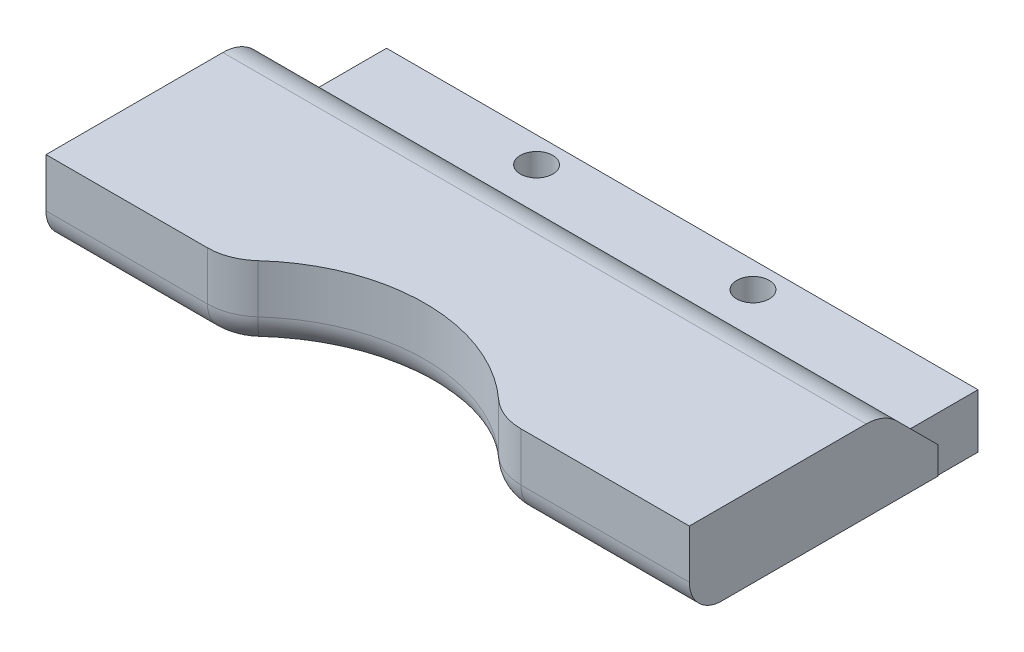
ISO-10303-21;
HEADER;
FILE_DESCRIPTION(('STEP AP214'),'2;1');
FILE_NAME('part.step','',(''),(''),'','','');
FILE_SCHEMA(('AUTOMOTIVE_DESIGN { 1 0 10303 214 1 1 1 1 }'));
ENDSEC;
DATA;
#1=APPLICATION_CONTEXT('core data for automotive mechanical design processes');
#2=APPLICATION_PROTOCOL_DEFINITION('international standard','automotive_design',2000,#1);
#3=PRODUCT_CONTEXT('',#1,'mechanical');
#4=PRODUCT('Part','Part','',(#3));
#5=PRODUCT_RELATED_PRODUCT_CATEGORY('part','',(#4));
#6=PRODUCT_DEFINITION_FORMATION('','',#4);
#7=PRODUCT_DEFINITION_CONTEXT('part definition',#1,'design');
#8=PRODUCT_DEFINITION('design','',#6,#7);
#9=PRODUCT_DEFINITION_SHAPE('','',#8);
#10=(LENGTH_UNIT() NAMED_UNIT(*) SI_UNIT(.MILLI.,.METRE.));
#11=(NAMED_UNIT(*) PLANE_ANGLE_UNIT() SI_UNIT($,.RADIAN.));
#12=(NAMED_UNIT(*) SI_UNIT($,.STERADIAN.) SOLID_ANGLE_UNIT());
#13=UNCERTAINTY_MEASURE_WITH_UNIT(LENGTH_MEASURE(1.E-05),#10,'distance_accuracy_value','');
#14=(GEOMETRIC_REPRESENTATION_CONTEXT(3) GLOBAL_UNCERTAINTY_ASSIGNED_CONTEXT((#13)) GLOBAL_UNIT_ASSIGNED_CONTEXT((#10,
#11,#12)) REPRESENTATION_CONTEXT('',''));
#15=CARTESIAN_POINT('',(0.,0.,0.));
#16=DIRECTION('',(0.,0.,1.));
#17=DIRECTION('',(1.,0.,0.));
#18=AXIS2_PLACEMENT_3D('',#15,#16,#17);
#19=CARTESIAN_POINT('',(0.,0.,11.11));
#20=DIRECTION('',(0.,0.,1.));
#21=DIRECTION('',(1.,0.,0.));
#22=AXIS2_PLACEMENT_3D('',#19,#20,#21);
#23=PLANE('',#22);
#24=DIRECTION('',(0.,-1.,0.));
#25=VECTOR('',#24,1.);
#26=CARTESIAN_POINT('',(-29.7300965377152,3.750174262941,11.11));
#27=LINE('',#26,#25);
#28=CARTESIAN_POINT('',(-29.7300965377152,3.75017426294096,11.11));
#29=VERTEX_POINT('',#28);
#30=CARTESIAN_POINT('',(-29.7300965377152,1.24982573705901,11.11));
#31=VERTEX_POINT('',#30);
#32=EDGE_CURVE('E246',#29,#31,#27,.T.);
#33=ORIENTED_EDGE('',*,*,#32,.F.);
#34=DIRECTION('',(1.,0.,0.));
#35=VECTOR('',#34,1.);
#36=CARTESIAN_POINT('',(29.7300965377152,3.75017426294096,11.11));
#37=LINE('',#36,#35);
#38=CARTESIAN_POINT('',(-26.2566275867251,3.75017426294096,11.11));
#39=VERTEX_POINT('',#38);
#40=EDGE_CURVE('E299',#29,#39,#37,.T.);
#41=ORIENTED_EDGE('',*,*,#40,.T.);
#42=DIRECTION('',(0.,-1.,0.));
#43=VECTOR('',#42,1.);
#44=CARTESIAN_POINT('',(-26.2566275867251,5.,11.11));
#45=LINE('',#44,#43);
#46=CARTESIAN_POINT('',(-26.2566275867251,1.24982573705901,11.11));
#47=VERTEX_POINT('',#46);
#48=EDGE_CURVE('E276',#39,#47,#45,.T.);
#49=ORIENTED_EDGE('',*,*,#48,.T.);
#50=DIRECTION('',(1.,0.,0.));
#51=VECTOR('',#50,1.);
#52=CARTESIAN_POINT('',(-29.7300965377152,1.24982573705901,11.11));
#53=LINE('',#52,#51);
#54=EDGE_CURVE('E242',#31,#47,#53,.T.);
#55=ORIENTED_EDGE('',*,*,#54,.F.);
#56=EDGE_LOOP('',(#33,#41,#49,#55));
#57=FACE_BOUND('',#56,.T.);
#58=ADVANCED_FACE('F71',(#57),#23,.F.);
#59=CARTESIAN_POINT('',(0.,0.,34.11));
#60=DIRECTION('',(0.,0.,1.));
#61=DIRECTION('',(1.,0.,0.));
#62=AXIS2_PLACEMENT_3D('',#59,#60,#61);
#63=PLANE('',#62);
#64=DIRECTION('',(0.,-1.,0.));
#65=VECTOR('',#64,1.);
#66=CARTESIAN_POINT('',(14.1694647091156,1.24982573705901,34.11));
#67=LINE('',#66,#65);
#68=CARTESIAN_POINT('',(14.1694647091156,8.750174262941,34.11));
#69=VERTEX_POINT('',#68);
#70=CARTESIAN_POINT('',(14.1694647091156,4.24982573705901,34.11));
#71=VERTEX_POINT('',#70);
#72=EDGE_CURVE('E340',#69,#71,#67,.T.);
#73=ORIENTED_EDGE('',*,*,#72,.T.);
#74=DIRECTION('',(1.,0.,0.));
#75=VECTOR('',#74,1.);
#76=CARTESIAN_POINT('',(29.7300965377152,4.24982573705901,34.11));
#77=LINE('',#76,#75);
#78=CARTESIAN_POINT('',(29.7300965377152,4.24982573705901,34.11));
#79=VERTEX_POINT('',#78);
#80=EDGE_CURVE('E343',#71,#79,#77,.T.);
#81=ORIENTED_EDGE('',*,*,#80,.T.);
#82=DIRECTION('',(0.,1.,0.));
#83=VECTOR('',#82,1.);
#84=CARTESIAN_POINT('',(29.7300965377152,3.750174262941,34.11));
#85=LINE('',#84,#83);
#86=CARTESIAN_POINT('',(29.7300965377152,8.750174262941,34.11));
#87=VERTEX_POINT('',#86);
#88=EDGE_CURVE('E228',#79,#87,#85,.T.);
#89=ORIENTED_EDGE('',*,*,#88,.T.);
#90=DIRECTION('',(1.,0.,0.));
#91=VECTOR('',#90,1.);
#92=CARTESIAN_POINT('',(12.0810416082533,8.750174262941,34.11));
#93=LINE('',#92,#91);
#94=EDGE_CURVE('E235',#69,#87,#93,.T.);
#95=ORIENTED_EDGE('',*,*,#94,.F.);
#96=EDGE_LOOP('',(#73,#81,#89,#95));
#97=FACE_BOUND('',#96,.T.);
#98=ADVANCED_FACE('F419',(#97),#63,.T.);
#99=CARTESIAN_POINT('',(0.,5.,0.));
#100=DIRECTION('',(0.,-1.,0.));
#101=DIRECTION('',(0.,0.,-1.));
#102=AXIS2_PLACEMENT_3D('',#99,#100,#101);
#103=PLANE('',#102);
#104=CARTESIAN_POINT('',(10.,5.,8.5));
#105=DIRECTION('',(0.,-1.,0.));
#106=DIRECTION('',(0.,0.,-1.));
#107=AXIS2_PLACEMENT_3D('',#104,#105,#106);
#108=CIRCLE('',#107,1.5);
#109=CARTESIAN_POINT('',(10.,5.,7.));
#110=VERTEX_POINT('',#109);
#111=EDGE_CURVE('E256',#110,#110,#108,.T.);
#112=ORIENTED_EDGE('',*,*,#111,.T.);
#113=EDGE_LOOP('',(#112));
#114=FACE_BOUND('',#113,.T.);
#115=DIRECTION('',(0.,0.,1.));
#116=VECTOR('',#115,1.);
#117=CARTESIAN_POINT('',(-26.2566275867251,5.,6.11));
#118=LINE('',#117,#116);
#119=CARTESIAN_POINT('',(-26.2566275867251,5.,6.11));
#120=VERTEX_POINT('',#119);
#121=CARTESIAN_POINT('',(-26.2566275867251,5.,12.3598257370591));
#122=VERTEX_POINT('',#121);
#123=EDGE_CURVE('E274',#120,#122,#118,.T.);
#124=ORIENTED_EDGE('',*,*,#123,.T.);
#125=DIRECTION('',(1.,0.,0.));
#126=VECTOR('',#125,1.);
#127=CARTESIAN_POINT('',(0.,5.,12.359825737059));
#128=LINE('',#127,#126);
#129=CARTESIAN_POINT('',(28.4076907050134,5.,12.3598257370591));
#130=VERTEX_POINT('',#129);
#131=EDGE_CURVE('E307',#122,#130,#128,.T.);
#132=ORIENTED_EDGE('',*,*,#131,.T.);
#133=DIRECTION('',(0.,0.,1.));
#134=VECTOR('',#133,1.);
#135=CARTESIAN_POINT('',(28.4076907050134,5.,6.11));
#136=LINE('',#135,#134);
#137=CARTESIAN_POINT('',(28.4076907050134,5.,6.11));
#138=VERTEX_POINT('',#137);
#139=EDGE_CURVE('E268',#138,#130,#136,.T.);
#140=ORIENTED_EDGE('',*,*,#139,.F.);
#141=DIRECTION('',(1.,0.,0.));
#142=VECTOR('',#141,1.);
#143=CARTESIAN_POINT('',(-26.2566275867251,5.,6.11));
#144=LINE('',#143,#142);
#145=EDGE_CURVE('E270',#120,#138,#144,.T.);
#146=ORIENTED_EDGE('',*,*,#145,.F.);
#147=EDGE_LOOP('',(#124,#132,#140,#146));
#148=FACE_BOUND('',#147,.T.);
#149=CARTESIAN_POINT('',(-10.,5.,8.5));
#150=DIRECTION('',(0.,1.,0.));
#151=DIRECTION('',(0.,0.,1.));
#152=AXIS2_PLACEMENT_3D('',#149,#150,#151);
#153=CIRCLE('',#152,1.5);
#154=CARTESIAN_POINT('',(-10.,5.,10.));
#155=VERTEX_POINT('',#154);
#156=EDGE_CURVE('E262',#155,#155,#153,.T.);
#157=ORIENTED_EDGE('',*,*,#156,.F.);
#158=EDGE_LOOP('',(#157));
#159=FACE_BOUND('',#158,.T.);
#160=ADVANCED_FACE('F449',(#114,#148,#159),#103,.F.);
#161=CARTESIAN_POINT('',(0.,0.,0.));
#162=DIRECTION('',(0.,-1.,0.));
#163=DIRECTION('',(0.,0.,-1.));
#164=AXIS2_PLACEMENT_3D('',#161,#162,#163);
#165=PLANE('',#164);
#166=CARTESIAN_POINT('',(10.,0.,8.5));
#167=DIRECTION('',(0.,-1.,0.));
#168=DIRECTION('',(0.,0.,-1.));
#169=AXIS2_PLACEMENT_3D('',#166,#167,#168);
#170=CIRCLE('',#169,1.5);
#171=CARTESIAN_POINT('',(10.,0.,7.));
#172=VERTEX_POINT('',#171);
#173=EDGE_CURVE('E255',#172,#172,#170,.T.);
#174=ORIENTED_EDGE('',*,*,#173,.F.);
#175=EDGE_LOOP('',(#174));
#176=FACE_BOUND('',#175,.T.);
#177=DIRECTION('',(1.,0.,0.));
#178=VECTOR('',#177,1.);
#179=CARTESIAN_POINT('',(-26.2566275867251,0.,11.11));
#180=LINE('',#179,#178);
#181=CARTESIAN_POINT('',(-26.2566275867251,0.,11.11));
#182=VERTEX_POINT('',#181);
#183=CARTESIAN_POINT('',(28.4076907050134,0.,11.11));
#184=VERTEX_POINT('',#183);
#185=EDGE_CURVE('E265',#182,#184,#180,.T.);
#186=ORIENTED_EDGE('',*,*,#185,.F.);
#187=DIRECTION('',(0.,0.,1.));
#188=VECTOR('',#187,1.);
#189=CARTESIAN_POINT('',(-26.2566275867251,0.,6.11));
#190=LINE('',#189,#188);
#191=CARTESIAN_POINT('',(-26.2566275867251,0.,6.11));
#192=VERTEX_POINT('',#191);
#193=EDGE_CURVE('E271',#192,#182,#190,.T.);
#194=ORIENTED_EDGE('',*,*,#193,.F.);
#195=DIRECTION('',(1.,0.,0.));
#196=VECTOR('',#195,1.);
#197=CARTESIAN_POINT('',(-26.2566275867251,0.,6.11));
#198=LINE('',#197,#196);
#199=CARTESIAN_POINT('',(28.4076907050134,0.,6.11));
#200=VERTEX_POINT('',#199);
#201=EDGE_CURVE('E282',#192,#200,#198,.T.);
#202=ORIENTED_EDGE('',*,*,#201,.T.);
#203=DIRECTION('',(0.,0.,1.));
#204=VECTOR('',#203,1.);
#205=CARTESIAN_POINT('',(28.4076907050134,0.,6.11));
#206=LINE('',#205,#204);
#207=EDGE_CURVE('E279',#200,#184,#206,.T.);
#208=ORIENTED_EDGE('',*,*,#207,.T.);
#209=EDGE_LOOP('',(#186,#194,#202,#208));
#210=FACE_BOUND('',#209,.T.);
#211=CARTESIAN_POINT('',(-10.,0.,8.5));
#212=DIRECTION('',(0.,1.,0.));
#213=DIRECTION('',(0.,0.,1.));
#214=AXIS2_PLACEMENT_3D('',#211,#212,#213);
#215=CIRCLE('',#214,1.5);
#216=CARTESIAN_POINT('',(-10.,0.,10.));
#217=VERTEX_POINT('',#216);
#218=EDGE_CURVE('E259',#217,#217,#215,.T.);
#219=ORIENTED_EDGE('',*,*,#218,.T.);
#220=EDGE_LOOP('',(#219));
#221=FACE_BOUND('',#220,.T.);
#222=ADVANCED_FACE('F480',(#176,#210,#221),#165,.T.);
#223=CARTESIAN_POINT('',(28.4076907050134,5.,6.11));
#224=DIRECTION('',(1.,0.,0.));
#225=DIRECTION('',(0.,0.,-1.));
#226=AXIS2_PLACEMENT_3D('',#223,#224,#225);
#227=PLANE('',#226);
#228=ORIENTED_EDGE('',*,*,#207,.F.);
#229=DIRECTION('',(0.,-1.,0.));
#230=VECTOR('',#229,1.);
#231=CARTESIAN_POINT('',(28.4076907050134,5.,6.11));
#232=LINE('',#231,#230);
#233=EDGE_CURVE('E290',#138,#200,#232,.T.);
#234=ORIENTED_EDGE('',*,*,#233,.F.);
#235=ORIENTED_EDGE('',*,*,#139,.T.);
#236=DIRECTION('',(0.,-0.707106781186544,-0.707106781186551));
#237=VECTOR('',#236,1.);
#238=CARTESIAN_POINT('',(28.4076907050134,8.75017426294101,16.1100000000001));
#239=LINE('',#238,#237);
#240=CARTESIAN_POINT('',(28.4076907050134,3.75017426294096,11.11));
#241=VERTEX_POINT('',#240);
#242=EDGE_CURVE('E310',#130,#241,#239,.T.);
#243=ORIENTED_EDGE('',*,*,#242,.T.);
#244=DIRECTION('',(0.,-1.,0.));
#245=VECTOR('',#244,1.);
#246=CARTESIAN_POINT('',(28.4076907050134,5.,11.11));
#247=LINE('',#246,#245);
#248=CARTESIAN_POINT('',(28.4076907050134,1.24982573705901,11.11));
#249=VERTEX_POINT('',#248);
#250=EDGE_CURVE('E292',#241,#249,#247,.T.);
#251=ORIENTED_EDGE('',*,*,#250,.T.);
#252=DIRECTION('',(0.,0.,-1.));
#253=VECTOR('',#252,1.);
#254=CARTESIAN_POINT('',(28.4076907050134,1.24982573705901,34.11));
#255=LINE('',#254,#253);
#256=CARTESIAN_POINT('',(28.4076907050134,1.24982573705901,15.9509142078914));
#257=VERTEX_POINT('',#256);
#258=EDGE_CURVE('E318',#257,#249,#255,.T.);
#259=ORIENTED_EDGE('',*,*,#258,.F.);
#260=CARTESIAN_POINT('',(28.4076907050134,-8.75017426294099,15.9509142078914));
#261=DIRECTION('',(1.,0.,0.));
#262=DIRECTION('',(0.,0.,-1.));
#263=AXIS2_PLACEMENT_3D('',#260,#261,#262);
#264=CIRCLE('',#263,10.);
#265=EDGE_CURVE('E320',#257,#184,#264,.F.);
#266=ORIENTED_EDGE('',*,*,#265,.T.);
#267=EDGE_LOOP('',(#228,#234,#235,#243,#251,#259,#266));
#268=FACE_BOUND('',#267,.T.);
#269=ADVANCED_FACE('F470',(#268),#227,.T.);
#270=CARTESIAN_POINT('',(-26.2566275867251,5.,6.11));
#271=DIRECTION('',(0.,0.,-1.));
#272=DIRECTION('',(-1.,0.,0.));
#273=AXIS2_PLACEMENT_3D('',#270,#271,#272);
#274=PLANE('',#273);
#275=ORIENTED_EDGE('',*,*,#201,.F.);
#276=DIRECTION('',(0.,-1.,0.));
#277=VECTOR('',#276,1.);
#278=CARTESIAN_POINT('',(-26.2566275867251,5.,6.11));
#279=LINE('',#278,#277);
#280=EDGE_CURVE('E288',#120,#192,#279,.T.);
#281=ORIENTED_EDGE('',*,*,#280,.F.);
#282=ORIENTED_EDGE('',*,*,#145,.T.);
#283=ORIENTED_EDGE('',*,*,#233,.T.);
#284=EDGE_LOOP('',(#275,#281,#282,#283));
#285=FACE_BOUND('',#284,.T.);
#286=ADVANCED_FACE('F482',(#285),#274,.T.);
#287=CARTESIAN_POINT('',(-26.2566275867251,5.,6.11));
#288=DIRECTION('',(1.,0.,0.));
#289=DIRECTION('',(0.,0.,-1.));
#290=AXIS2_PLACEMENT_3D('',#287,#288,#289);
#291=PLANE('',#290);
#292=ORIENTED_EDGE('',*,*,#193,.T.);
#293=CARTESIAN_POINT('',(-26.2566275867251,-8.75017426294099,15.9509142078914));
#294=DIRECTION('',(1.,0.,0.));
#295=DIRECTION('',(0.,0.,-1.));
#296=AXIS2_PLACEMENT_3D('',#293,#294,#295);
#297=CIRCLE('',#296,10.);
#298=CARTESIAN_POINT('',(-26.2566275867251,1.24982573705901,15.9509142078914));
#299=VERTEX_POINT('',#298);
#300=EDGE_CURVE('E322',#182,#299,#297,.T.);
#301=ORIENTED_EDGE('',*,*,#300,.T.);
#302=DIRECTION('',(0.,0.,1.));
#303=VECTOR('',#302,1.);
#304=CARTESIAN_POINT('',(-26.2566275867251,1.24982573705901,6.11));
#305=LINE('',#304,#303);
#306=EDGE_CURVE('E312',#47,#299,#305,.T.);
#307=ORIENTED_EDGE('',*,*,#306,.F.);
#308=ORIENTED_EDGE('',*,*,#48,.F.);
#309=DIRECTION('',(0.,0.707106781186544,0.707106781186551));
#310=VECTOR('',#309,1.);
#311=CARTESIAN_POINT('',(-26.2566275867251,1.87508713147048,9.23491286852949));
#312=LINE('',#311,#310);
#313=EDGE_CURVE('E304',#39,#122,#312,.T.);
#314=ORIENTED_EDGE('',*,*,#313,.T.);
#315=ORIENTED_EDGE('',*,*,#123,.F.);
#316=ORIENTED_EDGE('',*,*,#280,.T.);
#317=EDGE_LOOP('',(#292,#301,#307,#308,#314,#315,#316));
#318=FACE_BOUND('',#317,.T.);
#319=ADVANCED_FACE('F399',(#318),#291,.F.);
#320=CARTESIAN_POINT('',(-10.,5.,8.5));
#321=DIRECTION('',(0.,-1.,0.));
#322=DIRECTION('',(0.,0.,-1.));
#323=AXIS2_PLACEMENT_3D('',#320,#321,#322);
#324=CYLINDRICAL_SURFACE('',#323,1.5);
#325=ORIENTED_EDGE('',*,*,#156,.T.);
#326=EDGE_LOOP('',(#325));
#327=FACE_BOUND('',#326,.T.);
#328=ORIENTED_EDGE('',*,*,#218,.F.);
#329=EDGE_LOOP('',(#328));
#330=FACE_BOUND('',#329,.T.);
#331=ADVANCED_FACE('F461',(#327,#330),#324,.F.);
#332=CARTESIAN_POINT('',(10.,5.,8.5));
#333=DIRECTION('',(0.,-1.,0.));
#334=DIRECTION('',(0.,0.,-1.));
#335=AXIS2_PLACEMENT_3D('',#332,#333,#334);
#336=CYLINDRICAL_SURFACE('',#335,1.5);
#337=ORIENTED_EDGE('',*,*,#111,.F.);
#338=EDGE_LOOP('',(#337));
#339=FACE_BOUND('',#338,.T.);
#340=ORIENTED_EDGE('',*,*,#173,.T.);
#341=EDGE_LOOP('',(#340));
#342=FACE_BOUND('',#341,.T.);
#343=ADVANCED_FACE('F453',(#339,#342),#336,.F.);
#344=ORIENTED_EDGE('',*,*,#250,.F.);
#345=DIRECTION('',(1.,0.,0.));
#346=VECTOR('',#345,1.);
#347=CARTESIAN_POINT('',(29.7300965377152,3.75017426294096,11.11));
#348=LINE('',#347,#346);
#349=CARTESIAN_POINT('',(29.7300965377152,3.75017426294096,11.11));
#350=VERTEX_POINT('',#349);
#351=EDGE_CURVE('E297',#241,#350,#348,.T.);
#352=ORIENTED_EDGE('',*,*,#351,.T.);
#353=DIRECTION('',(0.,1.,0.));
#354=VECTOR('',#353,1.);
#355=CARTESIAN_POINT('',(29.7300965377152,3.750174262941,11.11));
#356=LINE('',#355,#354);
#357=CARTESIAN_POINT('',(29.7300965377152,1.24982573705901,11.11));
#358=VERTEX_POINT('',#357);
#359=EDGE_CURVE('E241',#358,#350,#356,.T.);
#360=ORIENTED_EDGE('',*,*,#359,.F.);
#361=EDGE_CURVE('E249',#249,#358,#53,.T.);
#362=ORIENTED_EDGE('',*,*,#361,.F.);
#363=EDGE_LOOP('',(#344,#352,#360,#362));
#364=FACE_BOUND('',#363,.T.);
#365=ADVANCED_FACE('F444',(#364),#23,.F.);
#366=CARTESIAN_POINT('',(29.7300965377152,3.750174262941,34.11));
#367=DIRECTION('',(-1.,0.,0.));
#368=DIRECTION('',(0.,0.,1.));
#369=AXIS2_PLACEMENT_3D('',#366,#367,#368);
#370=PLANE('',#369);
#371=ORIENTED_EDGE('',*,*,#88,.F.);
#372=CARTESIAN_POINT('',(29.7300965377152,4.24982573705901,31.11));
#373=DIRECTION('',(-1.,0.,0.));
#374=DIRECTION('',(0.,0.,1.));
#375=AXIS2_PLACEMENT_3D('',#372,#373,#374);
#376=CIRCLE('',#375,3.);
#377=CARTESIAN_POINT('',(29.7300965377152,1.24982573705901,31.11));
#378=VERTEX_POINT('',#377);
#379=EDGE_CURVE('E346',#79,#378,#376,.F.);
#380=ORIENTED_EDGE('',*,*,#379,.T.);
#381=DIRECTION('',(0.,0.,-1.));
#382=VECTOR('',#381,1.);
#383=CARTESIAN_POINT('',(29.7300965377152,1.24982573705901,34.11));
#384=LINE('',#383,#382);
#385=EDGE_CURVE('E227',#378,#358,#384,.T.);
#386=ORIENTED_EDGE('',*,*,#385,.T.);
#387=ORIENTED_EDGE('',*,*,#359,.T.);
#388=DIRECTION('',(0.,0.707106781186544,0.707106781186551));
#389=VECTOR('',#388,1.);
#390=CARTESIAN_POINT('',(29.7300965377152,8.750174262941,16.1100000000001));
#391=LINE('',#390,#389);
#392=CARTESIAN_POINT('',(29.7300965377152,7.57860138768721,14.9384271247463));
#393=VERTEX_POINT('',#392);
#394=EDGE_CURVE('E301',#350,#393,#391,.T.);
#395=ORIENTED_EDGE('',*,*,#394,.T.);
#396=CARTESIAN_POINT('',(29.7300965377152,4.750174262941,17.7668542494925));
#397=DIRECTION('',(-1.,0.,0.));
#398=DIRECTION('',(0.,0.,1.));
#399=AXIS2_PLACEMENT_3D('',#396,#397,#398);
#400=CIRCLE('',#399,4.);
#401=CARTESIAN_POINT('',(29.7300965377152,8.750174262941,17.7668542494925));
#402=VERTEX_POINT('',#401);
#403=EDGE_CURVE('E329',#393,#402,#400,.F.);
#404=ORIENTED_EDGE('',*,*,#403,.T.);
#405=DIRECTION('',(0.,0.,-1.));
#406=VECTOR('',#405,1.);
#407=CARTESIAN_POINT('',(29.7300965377152,8.750174262941,34.11));
#408=LINE('',#407,#406);
#409=EDGE_CURVE('E221',#87,#402,#408,.T.);
#410=ORIENTED_EDGE('',*,*,#409,.F.);
#411=EDGE_LOOP('',(#371,#380,#386,#387,#395,#404,#410));
#412=FACE_BOUND('',#411,.T.);
#413=ADVANCED_FACE('F422',(#412),#370,.F.);
#414=CARTESIAN_POINT('',(-29.7300965377152,3.750174262941,34.11));
#415=DIRECTION('',(1.,0.,0.));
#416=DIRECTION('',(0.,0.,-1.));
#417=AXIS2_PLACEMENT_3D('',#414,#415,#416);
#418=PLANE('',#417);
#419=DIRECTION('',(0.,0.,-1.));
#420=VECTOR('',#419,1.);
#421=CARTESIAN_POINT('',(-29.7300965377152,1.24982573705901,34.11));
#422=LINE('',#421,#420);
#423=CARTESIAN_POINT('',(-29.7300965377152,1.24982573705901,31.11));
#424=VERTEX_POINT('',#423);
#425=EDGE_CURVE('E253',#424,#31,#422,.T.);
#426=ORIENTED_EDGE('',*,*,#425,.F.);
#427=CARTESIAN_POINT('',(-29.7300965377152,4.24982573705901,31.11));
#428=DIRECTION('',(1.,0.,0.));
#429=DIRECTION('',(0.,0.,-1.));
#430=AXIS2_PLACEMENT_3D('',#427,#428,#429);
#431=CIRCLE('',#430,3.);
#432=CARTESIAN_POINT('',(-29.7300965377152,4.24982573705901,34.11));
#433=VERTEX_POINT('',#432);
#434=EDGE_CURVE('E95',#424,#433,#431,.F.);
#435=ORIENTED_EDGE('',*,*,#434,.T.);
#436=DIRECTION('',(0.,-1.,0.));
#437=VECTOR('',#436,1.);
#438=CARTESIAN_POINT('',(-29.7300965377152,3.750174262941,34.11));
#439=LINE('',#438,#437);
#440=CARTESIAN_POINT('',(-29.7300965377152,8.750174262941,34.11));
#441=VERTEX_POINT('',#440);
#442=EDGE_CURVE('E223',#441,#433,#439,.T.);
#443=ORIENTED_EDGE('',*,*,#442,.F.);
#444=DIRECTION('',(0.,0.,1.));
#445=VECTOR('',#444,1.);
#446=CARTESIAN_POINT('',(-29.7300965377152,8.750174262941,11.11));
#447=LINE('',#446,#445);
#448=CARTESIAN_POINT('',(-29.7300965377152,8.750174262941,17.7668542494925));
#449=VERTEX_POINT('',#448);
#450=EDGE_CURVE('E213',#449,#441,#447,.T.);
#451=ORIENTED_EDGE('',*,*,#450,.F.);
#452=CARTESIAN_POINT('',(-29.7300965377152,4.750174262941,17.7668542494925));
#453=DIRECTION('',(1.,0.,0.));
#454=DIRECTION('',(0.,0.,-1.));
#455=AXIS2_PLACEMENT_3D('',#452,#453,#454);
#456=CIRCLE('',#455,4.);
#457=CARTESIAN_POINT('',(-29.7300965377152,7.57860138768721,14.9384271247463));
#458=VERTEX_POINT('',#457);
#459=EDGE_CURVE('E325',#449,#458,#456,.F.);
#460=ORIENTED_EDGE('',*,*,#459,.T.);
#461=DIRECTION('',(0.,-0.707106781186544,-0.707106781186551));
#462=VECTOR('',#461,1.);
#463=CARTESIAN_POINT('',(-29.7300965377152,8.750174262941,16.1100000000001));
#464=LINE('',#463,#462);
#465=EDGE_CURVE('E295',#458,#29,#464,.T.);
#466=ORIENTED_EDGE('',*,*,#465,.T.);
#467=ORIENTED_EDGE('',*,*,#32,.T.);
#468=EDGE_LOOP('',(#426,#435,#443,#451,#460,#466,#467));
#469=FACE_BOUND('',#468,.T.);
#470=ADVANCED_FACE('F224',(#469),#418,.F.);
#471=CARTESIAN_POINT('',(-29.7300965377152,1.24982573705901,34.11));
#472=DIRECTION('',(0.,1.,0.));
#473=DIRECTION('',(0.,0.,1.));
#474=AXIS2_PLACEMENT_3D('',#471,#472,#473);
#475=PLANE('',#474);
#476=ORIENTED_EDGE('',*,*,#385,.F.);
#477=DIRECTION('',(1.,0.,0.));
#478=VECTOR('',#477,1.);
#479=CARTESIAN_POINT('',(14.1694647091156,1.24982573705901,31.11));
#480=LINE('',#479,#478);
#481=CARTESIAN_POINT('',(14.1694647091156,1.24982573705901,31.11));
#482=VERTEX_POINT('',#481);
#483=EDGE_CURVE('E356',#378,#482,#480,.F.);
#484=ORIENTED_EDGE('',*,*,#483,.T.);
#485=CARTESIAN_POINT('',(14.1694647091156,1.24982573705901,29.11));
#486=DIRECTION('',(0.,1.,0.));
#487=DIRECTION('',(0.,0.,1.));
#488=AXIS2_PLACEMENT_3D('',#485,#486,#487);
#489=CIRCLE('',#488,2.);
#490=CARTESIAN_POINT('',(12.8216075268723,1.24982573705901,30.5875929805853));
#491=VERTEX_POINT('',#490);
#492=EDGE_CURVE('E354',#482,#491,#489,.F.);
#493=ORIENTED_EDGE('',*,*,#492,.T.);
#494=CARTESIAN_POINT('',(-0.320000000000778,1.24982573705901,44.9941245412918));
#495=DIRECTION('',(0.,1.,0.));
#496=DIRECTION('',(0.,0.,1.));
#497=AXIS2_PLACEMENT_3D('',#494,#495,#496);
#498=CIRCLE('',#497,19.5);
#499=CARTESIAN_POINT('',(-13.4616075268738,1.24982573705901,30.5875929805853));
#500=VERTEX_POINT('',#499);
#501=EDGE_CURVE('E348',#491,#500,#498,.T.);
#502=ORIENTED_EDGE('',*,*,#501,.T.);
#503=CARTESIAN_POINT('',(-14.8094647091172,1.24982573705901,29.11));
#504=DIRECTION('',(0.,1.,0.));
#505=DIRECTION('',(0.,0.,1.));
#506=AXIS2_PLACEMENT_3D('',#503,#504,#505);
#507=CIRCLE('',#506,2.);
#508=CARTESIAN_POINT('',(-14.8094647091172,1.24982573705901,31.11));
#509=VERTEX_POINT('',#508);
#510=EDGE_CURVE('E350',#500,#509,#507,.F.);
#511=ORIENTED_EDGE('',*,*,#510,.T.);
#512=DIRECTION('',(1.,0.,0.));
#513=VECTOR('',#512,1.);
#514=CARTESIAN_POINT('',(-29.7300965377152,1.24982573705901,31.11));
#515=LINE('',#514,#513);
#516=EDGE_CURVE('E352',#509,#424,#515,.F.);
#517=ORIENTED_EDGE('',*,*,#516,.T.);
#518=ORIENTED_EDGE('',*,*,#425,.T.);
#519=ORIENTED_EDGE('',*,*,#54,.T.);
#520=ORIENTED_EDGE('',*,*,#306,.T.);
#521=DIRECTION('',(-1.,0.,0.));
#522=VECTOR('',#521,1.);
#523=CARTESIAN_POINT('',(-29.7300965377152,1.24982573705901,15.9509142078914));
#524=LINE('',#523,#522);
#525=EDGE_CURVE('E315',#299,#257,#524,.F.);
#526=ORIENTED_EDGE('',*,*,#525,.T.);
#527=ORIENTED_EDGE('',*,*,#258,.T.);
#528=ORIENTED_EDGE('',*,*,#361,.T.);
#529=EDGE_LOOP('',(#476,#484,#493,#502,#511,#517,#518,#519,#520,#526,#527,#528));
#530=FACE_BOUND('',#529,.T.);
#531=ADVANCED_FACE('F405',(#530),#475,.F.);
#532=ORIENTED_EDGE('',*,*,#442,.T.);
#533=DIRECTION('',(1.,0.,0.));
#534=VECTOR('',#533,1.);
#535=CARTESIAN_POINT('',(-14.8094647091172,4.24982573705901,34.11));
#536=LINE('',#535,#534);
#537=CARTESIAN_POINT('',(-14.8094647091172,4.24982573705901,34.11));
#538=VERTEX_POINT('',#537);
#539=EDGE_CURVE('E360',#433,#538,#536,.T.);
#540=ORIENTED_EDGE('',*,*,#539,.T.);
#541=DIRECTION('',(0.,-1.,0.));
#542=VECTOR('',#541,1.);
#543=CARTESIAN_POINT('',(-14.8094647091172,8.750174262941,34.11));
#544=LINE('',#543,#542);
#545=CARTESIAN_POINT('',(-14.8094647091172,8.750174262941,34.11));
#546=VERTEX_POINT('',#545);
#547=EDGE_CURVE('E231',#538,#546,#544,.F.);
#548=ORIENTED_EDGE('',*,*,#547,.T.);
#549=DIRECTION('',(1.,0.,0.));
#550=VECTOR('',#549,1.);
#551=CARTESIAN_POINT('',(-29.7300965377152,8.750174262941,34.11));
#552=LINE('',#551,#550);
#553=EDGE_CURVE('E216',#441,#546,#552,.T.);
#554=ORIENTED_EDGE('',*,*,#553,.F.);
#555=EDGE_LOOP('',(#532,#540,#548,#554));
#556=FACE_BOUND('',#555,.T.);
#557=ADVANCED_FACE('F230',(#556),#63,.T.);
#558=CARTESIAN_POINT('',(-0.320000000000778,-11.249825737059,44.9941245412918));
#559=DIRECTION('',(0.,1.,0.));
#560=DIRECTION('',(0.,0.,1.));
#561=AXIS2_PLACEMENT_3D('',#558,#559,#560);
#562=CYLINDRICAL_SURFACE('',#561,16.5);
#563=DIRECTION('',(0.,1.,0.));
#564=VECTOR('',#563,1.);
#565=CARTESIAN_POINT('',(-11.4398217535087,-11.249825737059,32.8039824514632));
#566=LINE('',#565,#564);
#567=CARTESIAN_POINT('',(-11.4398217535087,8.750174262941,32.8039824514632));
#568=VERTEX_POINT('',#567);
#569=CARTESIAN_POINT('',(-11.4398217535087,4.24982573705901,32.8039824514632));
#570=VERTEX_POINT('',#569);
#571=EDGE_CURVE('E333',#568,#570,#566,.F.);
#572=ORIENTED_EDGE('',*,*,#571,.T.);
#573=CARTESIAN_POINT('',(-0.320000000000778,4.24982573705901,44.9941245412918));
#574=DIRECTION('',(0.,1.,0.));
#575=DIRECTION('',(0.,0.,1.));
#576=AXIS2_PLACEMENT_3D('',#573,#574,#575);
#577=CIRCLE('',#576,16.5);
#578=CARTESIAN_POINT('',(10.7998217535072,4.24982573705901,32.8039824514632));
#579=VERTEX_POINT('',#578);
#580=EDGE_CURVE('E12',#570,#579,#577,.F.);
#581=ORIENTED_EDGE('',*,*,#580,.T.);
#582=DIRECTION('',(0.,1.,0.));
#583=VECTOR('',#582,1.);
#584=CARTESIAN_POINT('',(10.7998217535072,-11.249825737059,32.8039824514632));
#585=LINE('',#584,#583);
#586=CARTESIAN_POINT('',(10.7998217535072,8.750174262941,32.8039824514632));
#587=VERTEX_POINT('',#586);
#588=EDGE_CURVE('E331',#579,#587,#585,.T.);
#589=ORIENTED_EDGE('',*,*,#588,.T.);
#590=CARTESIAN_POINT('',(-0.320000000000778,8.750174262941,44.9941245412918));
#591=DIRECTION('',(0.,-1.,0.));
#592=DIRECTION('',(0.,0.,1.));
#593=AXIS2_PLACEMENT_3D('',#590,#591,#592);
#594=CIRCLE('',#593,16.5);
#595=EDGE_CURVE('E232',#568,#587,#594,.T.);
#596=ORIENTED_EDGE('',*,*,#595,.F.);
#597=EDGE_LOOP('',(#572,#581,#589,#596));
#598=FACE_BOUND('',#597,.T.);
#599=ADVANCED_FACE('F411',(#598),#562,.F.);
#600=CARTESIAN_POINT('',(-0.320000000000778,8.750174262941,44.9941245412918));
#601=DIRECTION('',(0.,1.,0.));
#602=DIRECTION('',(0.,0.,1.));
#603=AXIS2_PLACEMENT_3D('',#600,#601,#602);
#604=PLANE('',#603);
#605=ORIENTED_EDGE('',*,*,#553,.T.);
#606=CARTESIAN_POINT('',(-14.8094647091172,8.750174262941,29.11));
#607=DIRECTION('',(0.,1.,0.));
#608=DIRECTION('',(0.,0.,1.));
#609=AXIS2_PLACEMENT_3D('',#606,#607,#608);
#610=CIRCLE('',#609,5.);
#611=EDGE_CURVE('E338',#546,#568,#610,.T.);
#612=ORIENTED_EDGE('',*,*,#611,.T.);
#613=ORIENTED_EDGE('',*,*,#595,.T.);
#614=CARTESIAN_POINT('',(14.1694647091156,8.750174262941,29.11));
#615=DIRECTION('',(0.,1.,0.));
#616=DIRECTION('',(0.,0.,1.));
#617=AXIS2_PLACEMENT_3D('',#614,#615,#616);
#618=CIRCLE('',#617,5.);
#619=EDGE_CURVE('E336',#587,#69,#618,.T.);
#620=ORIENTED_EDGE('',*,*,#619,.T.);
#621=ORIENTED_EDGE('',*,*,#94,.T.);
#622=ORIENTED_EDGE('',*,*,#409,.T.);
#623=DIRECTION('',(-1.,0.,0.));
#624=VECTOR('',#623,1.);
#625=CARTESIAN_POINT('',(-0.320000000000778,8.750174262941,17.7668542494925));
#626=LINE('',#625,#624);
#627=EDGE_CURVE('E220',#402,#449,#626,.T.);
#628=ORIENTED_EDGE('',*,*,#627,.T.);
#629=ORIENTED_EDGE('',*,*,#450,.T.);
#630=EDGE_LOOP('',(#605,#612,#613,#620,#621,#622,#628,#629));
#631=FACE_BOUND('',#630,.T.);
#632=ADVANCED_FACE('F214',(#631),#604,.T.);
#633=CARTESIAN_POINT('',(-0.320000000000778,8.750174262941,16.1100000000001));
#634=DIRECTION('',(0.,0.707106781186551,-0.707106781186544));
#635=DIRECTION('',(1.,0.,0.));
#636=AXIS2_PLACEMENT_3D('',#633,#634,#635);
#637=PLANE('',#636);
#638=ORIENTED_EDGE('',*,*,#465,.F.);
#639=DIRECTION('',(-1.,0.,0.));
#640=VECTOR('',#639,1.);
#641=CARTESIAN_POINT('',(-0.320000000000778,7.57860138768721,14.9384271247463));
#642=LINE('',#641,#640);
#643=EDGE_CURVE('E327',#458,#393,#642,.F.);
#644=ORIENTED_EDGE('',*,*,#643,.T.);
#645=ORIENTED_EDGE('',*,*,#394,.F.);
#646=ORIENTED_EDGE('',*,*,#351,.F.);
#647=ORIENTED_EDGE('',*,*,#242,.F.);
#648=ORIENTED_EDGE('',*,*,#131,.F.);
#649=ORIENTED_EDGE('',*,*,#313,.F.);
#650=ORIENTED_EDGE('',*,*,#40,.F.);
#651=EDGE_LOOP('',(#638,#644,#645,#646,#647,#648,#649,#650));
#652=FACE_BOUND('',#651,.T.);
#653=ADVANCED_FACE('F391',(#652),#637,.T.);
#654=CARTESIAN_POINT('',(-26.2566275867251,-8.75017426294099,15.9509142078914));
#655=DIRECTION('',(-1.,0.,0.));
#656=DIRECTION('',(0.,0.,1.));
#657=AXIS2_PLACEMENT_3D('',#654,#655,#656);
#658=CYLINDRICAL_SURFACE('',#657,10.);
#659=ORIENTED_EDGE('',*,*,#300,.F.);
#660=ORIENTED_EDGE('',*,*,#185,.T.);
#661=ORIENTED_EDGE('',*,*,#265,.F.);
#662=ORIENTED_EDGE('',*,*,#525,.F.);
#663=EDGE_LOOP('',(#659,#660,#661,#662));
#664=FACE_BOUND('',#663,.T.);
#665=ADVANCED_FACE('F484',(#664),#658,.F.);
#666=CARTESIAN_POINT('',(-0.320000000000778,4.750174262941,17.7668542494925));
#667=DIRECTION('',(-1.,0.,0.));
#668=DIRECTION('',(0.,0.,1.));
#669=AXIS2_PLACEMENT_3D('',#666,#667,#668);
#670=CYLINDRICAL_SURFACE('',#669,4.);
#671=ORIENTED_EDGE('',*,*,#403,.F.);
#672=ORIENTED_EDGE('',*,*,#643,.F.);
#673=ORIENTED_EDGE('',*,*,#459,.F.);
#674=ORIENTED_EDGE('',*,*,#627,.F.);
#675=EDGE_LOOP('',(#671,#672,#673,#674));
#676=FACE_BOUND('',#675,.T.);
#677=ADVANCED_FACE('F385',(#676),#670,.T.);
#678=CARTESIAN_POINT('',(-14.8094647091172,-11.249825737059,29.11));
#679=DIRECTION('',(0.,1.,0.));
#680=DIRECTION('',(0.,0.,1.));
#681=AXIS2_PLACEMENT_3D('',#678,#679,#680);
#682=CYLINDRICAL_SURFACE('',#681,5.);
#683=ORIENTED_EDGE('',*,*,#547,.F.);
#684=CARTESIAN_POINT('',(-14.8094647091172,4.24982573705901,29.11));
#685=DIRECTION('',(0.,1.,0.));
#686=DIRECTION('',(0.,0.,1.));
#687=AXIS2_PLACEMENT_3D('',#684,#685,#686);
#688=CIRCLE('',#687,5.);
#689=EDGE_CURVE('E80',#538,#570,#688,.T.);
#690=ORIENTED_EDGE('',*,*,#689,.T.);
#691=ORIENTED_EDGE('',*,*,#571,.F.);
#692=ORIENTED_EDGE('',*,*,#611,.F.);
#693=EDGE_LOOP('',(#683,#690,#691,#692));
#694=FACE_BOUND('',#693,.T.);
#695=ADVANCED_FACE('F408',(#694),#682,.T.);
#696=CARTESIAN_POINT('',(14.1694647091156,-11.249825737059,29.11));
#697=DIRECTION('',(0.,1.,0.));
#698=DIRECTION('',(0.,0.,1.));
#699=AXIS2_PLACEMENT_3D('',#696,#697,#698);
#700=CYLINDRICAL_SURFACE('',#699,5.);
#701=ORIENTED_EDGE('',*,*,#588,.F.);
#702=CARTESIAN_POINT('',(14.1694647091156,4.24982573705901,29.11));
#703=DIRECTION('',(0.,1.,0.));
#704=DIRECTION('',(0.,0.,1.));
#705=AXIS2_PLACEMENT_3D('',#702,#703,#704);
#706=CIRCLE('',#705,5.);
#707=EDGE_CURVE('E358',#579,#71,#706,.T.);
#708=ORIENTED_EDGE('',*,*,#707,.T.);
#709=ORIENTED_EDGE('',*,*,#72,.F.);
#710=ORIENTED_EDGE('',*,*,#619,.F.);
#711=EDGE_LOOP('',(#701,#708,#709,#710));
#712=FACE_BOUND('',#711,.T.);
#713=ADVANCED_FACE('F417',(#712),#700,.T.);
#714=CARTESIAN_POINT('',(0.,4.24982573705901,31.11));
#715=DIRECTION('',(-1.,0.,0.));
#716=DIRECTION('',(0.,0.,1.));
#717=AXIS2_PLACEMENT_3D('',#714,#715,#716);
#718=CYLINDRICAL_SURFACE('',#717,3.);
#719=ORIENTED_EDGE('',*,*,#434,.F.);
#720=ORIENTED_EDGE('',*,*,#516,.F.);
#721=CARTESIAN_POINT('',(-14.8094647091172,4.24982573705901,31.11));
#722=DIRECTION('',(1.,0.,0.));
#723=DIRECTION('',(0.,0.,-1.));
#724=AXIS2_PLACEMENT_3D('',#721,#722,#723);
#725=CIRCLE('',#724,3.);
#726=EDGE_CURVE('E75',#538,#509,#725,.T.);
#727=ORIENTED_EDGE('',*,*,#726,.F.);
#728=ORIENTED_EDGE('',*,*,#539,.F.);
#729=EDGE_LOOP('',(#719,#720,#727,#728));
#730=FACE_BOUND('',#729,.T.);
#731=ADVANCED_FACE('F73',(#730),#718,.T.);
#732=CARTESIAN_POINT('',(-14.8094647091172,4.24982573705901,29.11));
#733=DIRECTION('',(0.,1.,0.));
#734=DIRECTION('',(0.,0.,1.));
#735=AXIS2_PLACEMENT_3D('',#732,#733,#734);
#736=DEGENERATE_TOROIDAL_SURFACE('',#735,2.,3.,.T.);
#737=ORIENTED_EDGE('',*,*,#726,.T.);
#738=ORIENTED_EDGE('',*,*,#510,.F.);
#739=CARTESIAN_POINT('',(-13.4616075268738,4.24982573705901,30.5875929805853));
#740=DIRECTION('',(0.738796490292644,0.,-0.673928591121693));
#741=DIRECTION('',(-0.673928591121693,0.,-0.738796490292644));
#742=AXIS2_PLACEMENT_3D('',#739,#740,#741);
#743=CIRCLE('',#742,3.);
#744=EDGE_CURVE('E369',#570,#500,#743,.T.);
#745=ORIENTED_EDGE('',*,*,#744,.F.);
#746=ORIENTED_EDGE('',*,*,#689,.F.);
#747=EDGE_LOOP('',(#737,#738,#745,#746));
#748=FACE_BOUND('',#747,.T.);
#749=ADVANCED_FACE('F435',(#748),#736,.T.);
#750=CARTESIAN_POINT('',(-0.320000000000778,4.24982573705901,44.9941245412918));
#751=DIRECTION('',(0.,1.,0.));
#752=DIRECTION('',(0.,0.,1.));
#753=AXIS2_PLACEMENT_3D('',#750,#751,#752);
#754=TOROIDAL_SURFACE('',#753,19.5,3.);
#755=ORIENTED_EDGE('',*,*,#744,.T.);
#756=ORIENTED_EDGE('',*,*,#501,.F.);
#757=CARTESIAN_POINT('',(12.8216075268723,4.24982573705901,30.5875929805853));
#758=DIRECTION('',(0.738796490292643,0.,0.673928591121695));
#759=DIRECTION('',(0.673928591121695,0.,-0.738796490292643));
#760=AXIS2_PLACEMENT_3D('',#757,#758,#759);
#761=CIRCLE('',#760,3.);
#762=EDGE_CURVE('E367',#579,#491,#761,.T.);
#763=ORIENTED_EDGE('',*,*,#762,.F.);
#764=ORIENTED_EDGE('',*,*,#580,.F.);
#765=EDGE_LOOP('',(#755,#756,#763,#764));
#766=FACE_BOUND('',#765,.T.);
#767=ADVANCED_FACE('F433',(#766),#754,.T.);
#768=CARTESIAN_POINT('',(14.1694647091156,4.24982573705901,29.11));
#769=DIRECTION('',(0.,1.,0.));
#770=DIRECTION('',(0.,0.,1.));
#771=AXIS2_PLACEMENT_3D('',#768,#769,#770);
#772=DEGENERATE_TOROIDAL_SURFACE('',#771,2.,3.,.T.);
#773=ORIENTED_EDGE('',*,*,#762,.T.);
#774=ORIENTED_EDGE('',*,*,#492,.F.);
#775=CARTESIAN_POINT('',(14.1694647091156,4.24982573705901,31.11));
#776=DIRECTION('',(1.,0.,0.));
#777=DIRECTION('',(0.,0.,-1.));
#778=AXIS2_PLACEMENT_3D('',#775,#776,#777);
#779=CIRCLE('',#778,3.);
#780=EDGE_CURVE('E364',#71,#482,#779,.T.);
#781=ORIENTED_EDGE('',*,*,#780,.F.);
#782=ORIENTED_EDGE('',*,*,#707,.F.);
#783=EDGE_LOOP('',(#773,#774,#781,#782));
#784=FACE_BOUND('',#783,.T.);
#785=ADVANCED_FACE('F432',(#784),#772,.T.);
#786=CARTESIAN_POINT('',(0.,4.24982573705901,31.11));
#787=DIRECTION('',(-1.,0.,0.));
#788=DIRECTION('',(0.,0.,1.));
#789=AXIS2_PLACEMENT_3D('',#786,#787,#788);
#790=CYLINDRICAL_SURFACE('',#789,3.);
#791=ORIENTED_EDGE('',*,*,#780,.T.);
#792=ORIENTED_EDGE('',*,*,#483,.F.);
#793=ORIENTED_EDGE('',*,*,#379,.F.);
#794=ORIENTED_EDGE('',*,*,#80,.F.);
#795=EDGE_LOOP('',(#791,#792,#793,#794));
#796=FACE_BOUND('',#795,.T.);
#797=ADVANCED_FACE('F429',(#796),#790,.T.);
#798=CLOSED_SHELL('',(#58,#98,#160,#222,#269,#286,#319,#331,#343,#365,#413,#470,#531,#557,#599,
#632,#653,#665,#677,#695,#713,#731,#749,#767,#785,#797));
#799=MANIFOLD_SOLID_BREP('B2',#798);
#800=ADVANCED_BREP_SHAPE_REPRESENTATION('',(#18,#799),#14);
#801=SHAPE_DEFINITION_REPRESENTATION(#9,#800);
ENDSEC;
END-ISO-10303-21;
